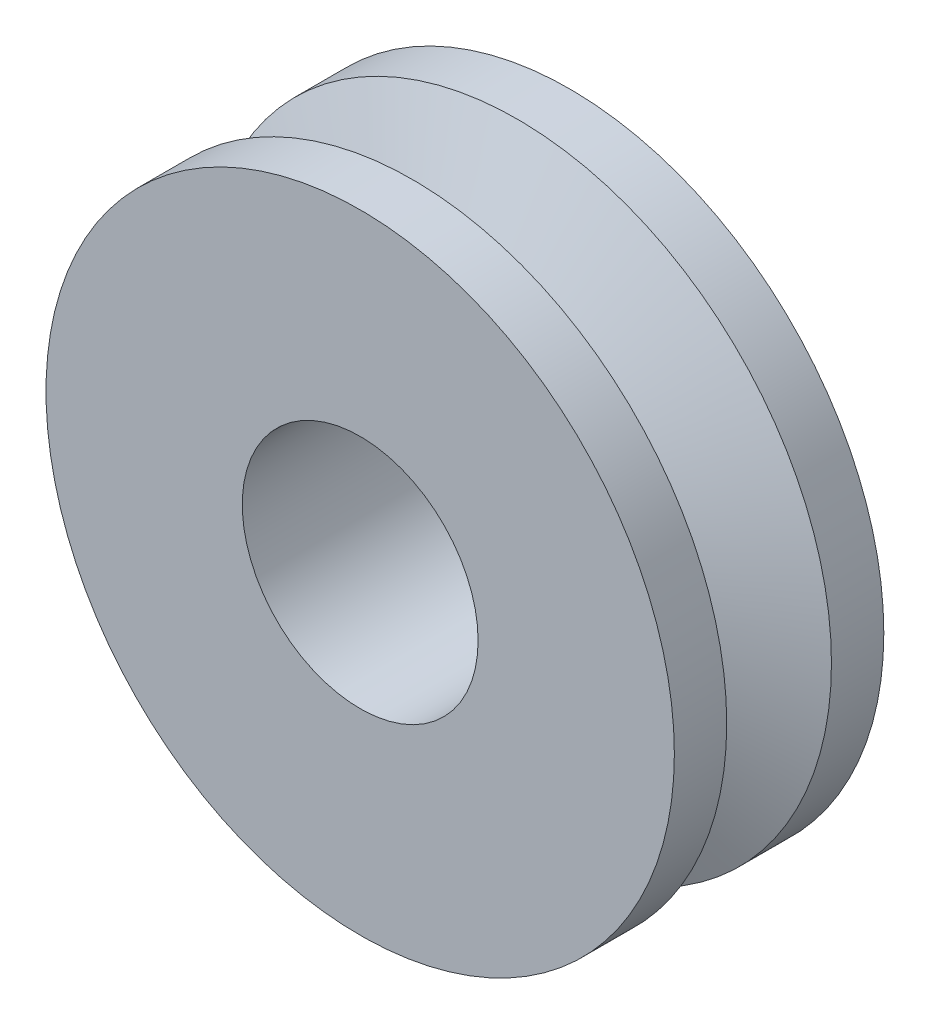
ISO-10303-21;
HEADER;
FILE_DESCRIPTION(('STEP AP214'),'2;1');
FILE_NAME('part.step','',(''),(''),'','','');
FILE_SCHEMA(('AUTOMOTIVE_DESIGN { 1 0 10303 214 1 1 1 1 }'));
ENDSEC;
DATA;
#1=APPLICATION_CONTEXT('core data for automotive mechanical design processes');
#2=APPLICATION_PROTOCOL_DEFINITION('international standard','automotive_design',2000,#1);
#3=PRODUCT_CONTEXT('',#1,'mechanical');
#4=PRODUCT('Part','Part','',(#3));
#5=PRODUCT_RELATED_PRODUCT_CATEGORY('part','',(#4));
#6=PRODUCT_DEFINITION_FORMATION('','',#4);
#7=PRODUCT_DEFINITION_CONTEXT('part definition',#1,'design');
#8=PRODUCT_DEFINITION('design','',#6,#7);
#9=PRODUCT_DEFINITION_SHAPE('','',#8);
#10=(LENGTH_UNIT() NAMED_UNIT(*) SI_UNIT(.MILLI.,.METRE.));
#11=(NAMED_UNIT(*) PLANE_ANGLE_UNIT() SI_UNIT($,.RADIAN.));
#12=(NAMED_UNIT(*) SI_UNIT($,.STERADIAN.) SOLID_ANGLE_UNIT());
#13=UNCERTAINTY_MEASURE_WITH_UNIT(LENGTH_MEASURE(1.E-05),#10,'distance_accuracy_value','');
#14=(GEOMETRIC_REPRESENTATION_CONTEXT(3) GLOBAL_UNCERTAINTY_ASSIGNED_CONTEXT((#13)) GLOBAL_UNIT_ASSIGNED_CONTEXT((#10,
#11,#12)) REPRESENTATION_CONTEXT('',''));
#15=CARTESIAN_POINT('',(0.,0.,0.));
#16=DIRECTION('',(0.,0.,1.));
#17=DIRECTION('',(1.,0.,0.));
#18=AXIS2_PLACEMENT_3D('',#15,#16,#17);
#19=CARTESIAN_POINT('',(0.,15.,5.));
#20=DIRECTION('',(0.,0.,-1.));
#21=DIRECTION('',(-1.,0.,0.));
#22=AXIS2_PLACEMENT_3D('',#19,#20,#21);
#23=PLANE('',#22);
#24=CARTESIAN_POINT('',(0.,0.,5.));
#25=DIRECTION('',(0.,0.,1.));
#26=DIRECTION('',(1.,0.,0.));
#27=AXIS2_PLACEMENT_3D('',#24,#25,#26);
#28=CIRCLE('',#27,5.63);
#29=CARTESIAN_POINT('',(5.63,0.,5.));
#30=VERTEX_POINT('',#29);
#31=EDGE_CURVE('E10',#30,#30,#28,.T.);
#32=ORIENTED_EDGE('',*,*,#31,.F.);
#33=EDGE_LOOP('',(#32));
#34=FACE_BOUND('',#33,.T.);
#35=CARTESIAN_POINT('',(0.,0.,5.));
#36=DIRECTION('',(0.,0.,1.));
#37=DIRECTION('',(1.,0.,0.));
#38=AXIS2_PLACEMENT_3D('',#35,#36,#37);
#39=CIRCLE('',#38,15.);
#40=CARTESIAN_POINT('',(15.,0.,5.));
#41=VERTEX_POINT('',#40);
#42=EDGE_CURVE('E74',#41,#41,#39,.T.);
#43=ORIENTED_EDGE('',*,*,#42,.T.);
#44=EDGE_LOOP('',(#43));
#45=FACE_BOUND('',#44,.T.);
#46=ADVANCED_FACE('F43',(#34,#45),#23,.F.);
#47=CARTESIAN_POINT('',(0.,0.,13.1988079470199));
#48=DIRECTION('',(0.,0.,1.));
#49=DIRECTION('',(1.,0.,0.));
#50=AXIS2_PLACEMENT_3D('',#47,#48,#49);
#51=CYLINDRICAL_SURFACE('',#50,5.63);
#52=CARTESIAN_POINT('',(0.,0.,-5.));
#53=DIRECTION('',(0.,0.,1.));
#54=DIRECTION('',(1.,0.,0.));
#55=AXIS2_PLACEMENT_3D('',#52,#53,#54);
#56=CIRCLE('',#55,5.63);
#57=CARTESIAN_POINT('',(5.63,0.,-5.));
#58=VERTEX_POINT('',#57);
#59=EDGE_CURVE('E50',#58,#58,#56,.T.);
#60=ORIENTED_EDGE('',*,*,#59,.F.);
#61=EDGE_LOOP('',(#60));
#62=FACE_BOUND('',#61,.T.);
#63=ORIENTED_EDGE('',*,*,#31,.T.);
#64=EDGE_LOOP('',(#63));
#65=FACE_BOUND('',#64,.T.);
#66=ADVANCED_FACE('F106',(#62,#65),#51,.F.);
#67=CARTESIAN_POINT('',(0.,15.,-5.));
#68=DIRECTION('',(0.,0.,1.));
#69=DIRECTION('',(1.,0.,0.));
#70=AXIS2_PLACEMENT_3D('',#67,#68,#69);
#71=PLANE('',#70);
#72=CARTESIAN_POINT('',(0.,0.,-5.));
#73=DIRECTION('',(0.,0.,1.));
#74=DIRECTION('',(1.,0.,0.));
#75=AXIS2_PLACEMENT_3D('',#72,#73,#74);
#76=CIRCLE('',#75,15.);
#77=CARTESIAN_POINT('',(15.,0.,-5.));
#78=VERTEX_POINT('',#77);
#79=EDGE_CURVE('E55',#78,#78,#76,.T.);
#80=ORIENTED_EDGE('',*,*,#79,.F.);
#81=EDGE_LOOP('',(#80));
#82=FACE_BOUND('',#81,.T.);
#83=ORIENTED_EDGE('',*,*,#59,.T.);
#84=EDGE_LOOP('',(#83));
#85=FACE_BOUND('',#84,.T.);
#86=ADVANCED_FACE('F101',(#82,#85),#71,.F.);
#87=CARTESIAN_POINT('',(0.,0.,13.1988079470199));
#88=DIRECTION('',(0.,0.,1.));
#89=DIRECTION('',(1.,0.,0.));
#90=AXIS2_PLACEMENT_3D('',#87,#88,#89);
#91=CYLINDRICAL_SURFACE('',#90,15.);
#92=CARTESIAN_POINT('',(0.,0.,-2.5));
#93=DIRECTION('',(0.,0.,1.));
#94=DIRECTION('',(1.,0.,0.));
#95=AXIS2_PLACEMENT_3D('',#92,#93,#94);
#96=CIRCLE('',#95,15.);
#97=CARTESIAN_POINT('',(15.,0.,-2.5));
#98=VERTEX_POINT('',#97);
#99=EDGE_CURVE('E60',#98,#98,#96,.T.);
#100=ORIENTED_EDGE('',*,*,#99,.F.);
#101=EDGE_LOOP('',(#100));
#102=FACE_BOUND('',#101,.T.);
#103=ORIENTED_EDGE('',*,*,#79,.T.);
#104=EDGE_LOOP('',(#103));
#105=FACE_BOUND('',#104,.T.);
#106=ADVANCED_FACE('F95',(#102,#105),#91,.T.);
#107=CARTESIAN_POINT('',(0.,0.,-2.5));
#108=DIRECTION('',(0.,0.,-1.));
#109=DIRECTION('',(-1.,0.,0.));
#110=AXIS2_PLACEMENT_3D('',#107,#108,#109);
#111=CONICAL_SURFACE('',#110,15.,1.17809724509617);
#112=CARTESIAN_POINT('',(0.,0.,0.));
#113=DIRECTION('',(0.,0.,1.));
#114=DIRECTION('',(1.,0.,0.));
#115=AXIS2_PLACEMENT_3D('',#112,#113,#114);
#116=CIRCLE('',#115,8.96446609406722);
#117=CARTESIAN_POINT('',(8.96446609406722,0.,0.));
#118=VERTEX_POINT('',#117);
#119=EDGE_CURVE('E66',#118,#118,#116,.T.);
#120=ORIENTED_EDGE('',*,*,#119,.F.);
#121=EDGE_LOOP('',(#120));
#122=FACE_BOUND('',#121,.T.);
#123=ORIENTED_EDGE('',*,*,#99,.T.);
#124=EDGE_LOOP('',(#123));
#125=FACE_BOUND('',#124,.T.);
#126=ADVANCED_FACE('F89',(#122,#125),#111,.T.);
#127=CARTESIAN_POINT('',(0.,0.,0.));
#128=DIRECTION('',(0.,0.,1.));
#129=DIRECTION('',(1.,0.,0.));
#130=AXIS2_PLACEMENT_3D('',#127,#128,#129);
#131=CONICAL_SURFACE('',#130,8.96446609406722,1.17809724509617);
#132=CARTESIAN_POINT('',(0.,0.,2.5));
#133=DIRECTION('',(0.,0.,1.));
#134=DIRECTION('',(1.,0.,0.));
#135=AXIS2_PLACEMENT_3D('',#132,#133,#134);
#136=CIRCLE('',#135,15.);
#137=CARTESIAN_POINT('',(15.,0.,2.5));
#138=VERTEX_POINT('',#137);
#139=EDGE_CURVE('E70',#138,#138,#136,.T.);
#140=ORIENTED_EDGE('',*,*,#139,.F.);
#141=EDGE_LOOP('',(#140));
#142=FACE_BOUND('',#141,.T.);
#143=ORIENTED_EDGE('',*,*,#119,.T.);
#144=EDGE_LOOP('',(#143));
#145=FACE_BOUND('',#144,.T.);
#146=ADVANCED_FACE('F83',(#142,#145),#131,.T.);
#147=CARTESIAN_POINT('',(0.,0.,13.1988079470199));
#148=DIRECTION('',(0.,0.,1.));
#149=DIRECTION('',(1.,0.,0.));
#150=AXIS2_PLACEMENT_3D('',#147,#148,#149);
#151=CYLINDRICAL_SURFACE('',#150,15.);
#152=ORIENTED_EDGE('',*,*,#42,.F.);
#153=EDGE_LOOP('',(#152));
#154=FACE_BOUND('',#153,.T.);
#155=ORIENTED_EDGE('',*,*,#139,.T.);
#156=EDGE_LOOP('',(#155));
#157=FACE_BOUND('',#156,.T.);
#158=ADVANCED_FACE('F80',(#154,#157),#151,.T.);
#159=CLOSED_SHELL('',(#46,#66,#86,#106,#126,#146,#158));
#160=MANIFOLD_SOLID_BREP('B2',#159);
#161=ADVANCED_BREP_SHAPE_REPRESENTATION('',(#18,#160),#14);
#162=SHAPE_DEFINITION_REPRESENTATION(#9,#161);
ENDSEC;
END-ISO-10303-21;
